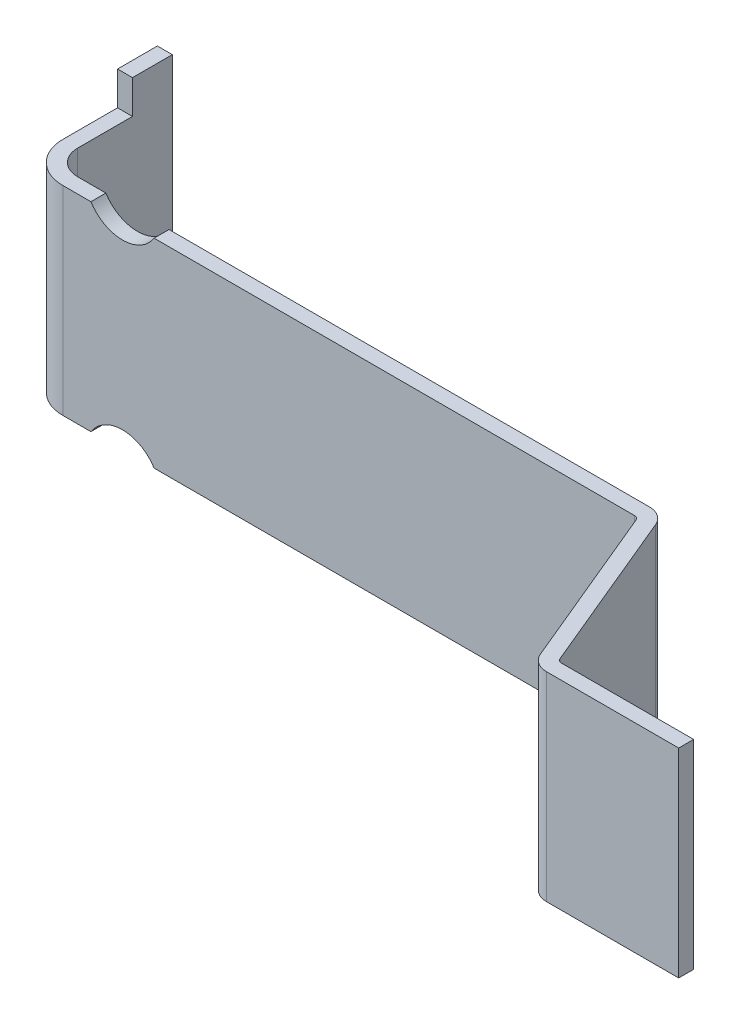
ISO-10303-21;
HEADER;
FILE_DESCRIPTION(('STEP AP214'),'2;1');
FILE_NAME('part.step','',(''),(''),'','','');
FILE_SCHEMA(('AUTOMOTIVE_DESIGN { 1 0 10303 214 1 1 1 1 }'));
ENDSEC;
DATA;
#1=APPLICATION_CONTEXT('core data for automotive mechanical design processes');
#2=APPLICATION_PROTOCOL_DEFINITION('international standard','automotive_design',2000,#1);
#3=PRODUCT_CONTEXT('',#1,'mechanical');
#4=PRODUCT('Part','Part','',(#3));
#5=PRODUCT_RELATED_PRODUCT_CATEGORY('part','',(#4));
#6=PRODUCT_DEFINITION_FORMATION('','',#4);
#7=PRODUCT_DEFINITION_CONTEXT('part definition',#1,'design');
#8=PRODUCT_DEFINITION('design','',#6,#7);
#9=PRODUCT_DEFINITION_SHAPE('','',#8);
#10=(LENGTH_UNIT() NAMED_UNIT(*) SI_UNIT(.MILLI.,.METRE.));
#11=(NAMED_UNIT(*) PLANE_ANGLE_UNIT() SI_UNIT($,.RADIAN.));
#12=(NAMED_UNIT(*) SI_UNIT($,.STERADIAN.) SOLID_ANGLE_UNIT());
#13=UNCERTAINTY_MEASURE_WITH_UNIT(LENGTH_MEASURE(1.E-05),#10,'distance_accuracy_value','');
#14=(GEOMETRIC_REPRESENTATION_CONTEXT(3) GLOBAL_UNCERTAINTY_ASSIGNED_CONTEXT((#13)) GLOBAL_UNIT_ASSIGNED_CONTEXT((#10,
#11,#12)) REPRESENTATION_CONTEXT('',''));
#15=CARTESIAN_POINT('',(0.,0.,0.));
#16=DIRECTION('',(0.,0.,1.));
#17=DIRECTION('',(1.,0.,0.));
#18=AXIS2_PLACEMENT_3D('',#15,#16,#17);
#19=CARTESIAN_POINT('',(0.15,0.,-0.4));
#20=DIRECTION('',(1.,0.,0.));
#21=DIRECTION('',(0.,0.,-1.));
#22=AXIS2_PLACEMENT_3D('',#19,#20,#21);
#23=PLANE('',#22);
#24=DIRECTION('',(0.,0.,1.));
#25=VECTOR('',#24,1.);
#26=CARTESIAN_POINT('',(0.15,2.675,0.));
#27=LINE('',#26,#25);
#28=CARTESIAN_POINT('',(0.15,2.675,0.4));
#29=VERTEX_POINT('',#28);
#30=CARTESIAN_POINT('',(0.15,2.675,-0.4));
#31=VERTEX_POINT('',#30);
#32=EDGE_CURVE('E302',#29,#31,#27,.F.);
#33=ORIENTED_EDGE('',*,*,#32,.F.);
#34=DIRECTION('',(0.,1.,0.));
#35=VECTOR('',#34,1.);
#36=CARTESIAN_POINT('',(0.15,0.,0.4));
#37=LINE('',#36,#35);
#38=CARTESIAN_POINT('',(0.15,2.,0.4));
#39=VERTEX_POINT('',#38);
#40=EDGE_CURVE('E306',#29,#39,#37,.F.);
#41=ORIENTED_EDGE('',*,*,#40,.T.);
#42=DIRECTION('',(0.,0.,-1.));
#43=VECTOR('',#42,1.);
#44=CARTESIAN_POINT('',(0.15,2.,-0.4));
#45=LINE('',#44,#43);
#46=CARTESIAN_POINT('',(0.15,2.,1.5));
#47=VERTEX_POINT('',#46);
#48=EDGE_CURVE('E314',#39,#47,#45,.F.);
#49=ORIENTED_EDGE('',*,*,#48,.T.);
#50=DIRECTION('',(0.,1.,0.));
#51=VECTOR('',#50,1.);
#52=CARTESIAN_POINT('',(0.150000000000001,0.,1.5));
#53=LINE('',#52,#51);
#54=CARTESIAN_POINT('',(0.15,-2.,1.5));
#55=VERTEX_POINT('',#54);
#56=EDGE_CURVE('E309',#47,#55,#53,.F.);
#57=ORIENTED_EDGE('',*,*,#56,.T.);
#58=DIRECTION('',(0.,0.,-1.));
#59=VECTOR('',#58,1.);
#60=CARTESIAN_POINT('',(0.15,-2.,-0.4));
#61=LINE('',#60,#59);
#62=CARTESIAN_POINT('',(0.15,-2.,0.4));
#63=VERTEX_POINT('',#62);
#64=EDGE_CURVE('E316',#55,#63,#61,.T.);
#65=ORIENTED_EDGE('',*,*,#64,.T.);
#66=DIRECTION('',(0.,1.,0.));
#67=VECTOR('',#66,1.);
#68=CARTESIAN_POINT('',(0.15,0.,0.4));
#69=LINE('',#68,#67);
#70=CARTESIAN_POINT('',(0.15,-2.675,0.4));
#71=VERTEX_POINT('',#70);
#72=EDGE_CURVE('E321',#63,#71,#69,.F.);
#73=ORIENTED_EDGE('',*,*,#72,.T.);
#74=DIRECTION('',(0.,0.,1.));
#75=VECTOR('',#74,1.);
#76=CARTESIAN_POINT('',(0.15,-2.675,0.));
#77=LINE('',#76,#75);
#78=CARTESIAN_POINT('',(0.15,-2.675,-0.4));
#79=VERTEX_POINT('',#78);
#80=EDGE_CURVE('E280',#71,#79,#77,.F.);
#81=ORIENTED_EDGE('',*,*,#80,.T.);
#82=DIRECTION('',(0.,1.,0.));
#83=VECTOR('',#82,1.);
#84=CARTESIAN_POINT('',(0.15,0.,-0.4));
#85=LINE('',#84,#83);
#86=EDGE_CURVE('E305',#31,#79,#85,.F.);
#87=ORIENTED_EDGE('',*,*,#86,.F.);
#88=EDGE_LOOP('',(#33,#41,#49,#57,#65,#73,#81,#87));
#89=FACE_BOUND('',#88,.T.);
#90=ADVANCED_FACE('F16',(#89),#23,.T.);
#91=CARTESIAN_POINT('',(0.,2.675,0.));
#92=DIRECTION('',(0.,1.,0.));
#93=DIRECTION('',(0.,0.,1.));
#94=AXIS2_PLACEMENT_3D('',#91,#92,#93);
#95=PLANE('',#94);
#96=DIRECTION('',(-1.,0.,0.));
#97=VECTOR('',#96,1.);
#98=CARTESIAN_POINT('',(-0.15,2.675,-0.4));
#99=LINE('',#98,#97);
#100=CARTESIAN_POINT('',(-0.15,2.675,-0.4));
#101=VERTEX_POINT('',#100);
#102=EDGE_CURVE('E283',#101,#31,#99,.F.);
#103=ORIENTED_EDGE('',*,*,#102,.F.);
#104=DIRECTION('',(0.,0.,1.));
#105=VECTOR('',#104,1.);
#106=CARTESIAN_POINT('',(-0.15,2.675,1.5));
#107=LINE('',#106,#105);
#108=CARTESIAN_POINT('',(-0.15,2.675,0.4));
#109=VERTEX_POINT('',#108);
#110=EDGE_CURVE('E253',#109,#101,#107,.F.);
#111=ORIENTED_EDGE('',*,*,#110,.F.);
#112=DIRECTION('',(1.,0.,0.));
#113=VECTOR('',#112,1.);
#114=CARTESIAN_POINT('',(-0.15,2.675,0.4));
#115=LINE('',#114,#113);
#116=EDGE_CURVE('E257',#29,#109,#115,.F.);
#117=ORIENTED_EDGE('',*,*,#116,.F.);
#118=ORIENTED_EDGE('',*,*,#32,.T.);
#119=EDGE_LOOP('',(#103,#111,#117,#118));
#120=FACE_BOUND('',#119,.T.);
#121=ADVANCED_FACE('F671',(#120),#95,.T.);
#122=CARTESIAN_POINT('',(-0.15,0.,-0.4));
#123=DIRECTION('',(0.,0.,-1.));
#124=DIRECTION('',(-1.,0.,0.));
#125=AXIS2_PLACEMENT_3D('',#122,#123,#124);
#126=PLANE('',#125);
#127=DIRECTION('',(0.,1.,0.));
#128=VECTOR('',#127,1.);
#129=CARTESIAN_POINT('',(-0.15,0.,-0.4));
#130=LINE('',#129,#128);
#131=CARTESIAN_POINT('',(-0.15,-2.675,-0.4));
#132=VERTEX_POINT('',#131);
#133=EDGE_CURVE('E250',#101,#132,#130,.F.);
#134=ORIENTED_EDGE('',*,*,#133,.F.);
#135=ORIENTED_EDGE('',*,*,#102,.T.);
#136=ORIENTED_EDGE('',*,*,#86,.T.);
#137=DIRECTION('',(1.,0.,0.));
#138=VECTOR('',#137,1.);
#139=CARTESIAN_POINT('',(0.,-2.675,-0.4));
#140=LINE('',#139,#138);
#141=EDGE_CURVE('E143',#79,#132,#140,.F.);
#142=ORIENTED_EDGE('',*,*,#141,.T.);
#143=EDGE_LOOP('',(#134,#135,#136,#142));
#144=FACE_BOUND('',#143,.T.);
#145=ADVANCED_FACE('F662',(#144),#126,.T.);
#146=CARTESIAN_POINT('',(0.,-2.675,0.));
#147=DIRECTION('',(0.,1.,0.));
#148=DIRECTION('',(0.,0.,1.));
#149=AXIS2_PLACEMENT_3D('',#146,#147,#148);
#150=PLANE('',#149);
#151=ORIENTED_EDGE('',*,*,#80,.F.);
#152=DIRECTION('',(1.,0.,0.));
#153=VECTOR('',#152,1.);
#154=CARTESIAN_POINT('',(-0.15,-2.675,0.4));
#155=LINE('',#154,#153);
#156=CARTESIAN_POINT('',(-0.15,-2.675,0.4));
#157=VERTEX_POINT('',#156);
#158=EDGE_CURVE('E150',#157,#71,#155,.T.);
#159=ORIENTED_EDGE('',*,*,#158,.F.);
#160=DIRECTION('',(0.,0.,1.));
#161=VECTOR('',#160,1.);
#162=CARTESIAN_POINT('',(-0.15,-2.675,1.5));
#163=LINE('',#162,#161);
#164=EDGE_CURVE('E247',#132,#157,#163,.T.);
#165=ORIENTED_EDGE('',*,*,#164,.F.);
#166=ORIENTED_EDGE('',*,*,#141,.F.);
#167=EDGE_LOOP('',(#151,#159,#165,#166));
#168=FACE_BOUND('',#167,.T.);
#169=ADVANCED_FACE('F654',(#168),#150,.F.);
#170=CARTESIAN_POINT('',(13.9666666666667,0.,5.5));
#171=DIRECTION('',(0.,1.,0.));
#172=DIRECTION('',(0.,0.,1.));
#173=AXIS2_PLACEMENT_3D('',#170,#171,#172);
#174=CYLINDRICAL_SURFACE('',#173,0.400000000000004);
#175=CARTESIAN_POINT('',(13.9666666666667,-2.,5.5));
#176=DIRECTION('',(0.,1.,0.));
#177=DIRECTION('',(0.,0.,1.));
#178=AXIS2_PLACEMENT_3D('',#175,#176,#177);
#179=CIRCLE('',#178,0.400000000000004);
#180=CARTESIAN_POINT('',(13.5974358974359,-2.,5.65384615384615));
#181=VERTEX_POINT('',#180);
#182=CARTESIAN_POINT('',(13.9666666666667,-2.,5.9));
#183=VERTEX_POINT('',#182);
#184=EDGE_CURVE('E142',#181,#183,#179,.T.);
#185=ORIENTED_EDGE('',*,*,#184,.T.);
#186=DIRECTION('',(0.,1.,0.));
#187=VECTOR('',#186,1.);
#188=CARTESIAN_POINT('',(13.9666666666667,0.,5.9));
#189=LINE('',#188,#187);
#190=CARTESIAN_POINT('',(13.9666666666667,2.,5.9));
#191=VERTEX_POINT('',#190);
#192=EDGE_CURVE('E140',#191,#183,#189,.F.);
#193=ORIENTED_EDGE('',*,*,#192,.F.);
#194=CARTESIAN_POINT('',(13.9666666666667,2.,5.5));
#195=DIRECTION('',(0.,1.,0.));
#196=DIRECTION('',(0.,0.,1.));
#197=AXIS2_PLACEMENT_3D('',#194,#195,#196);
#198=CIRCLE('',#197,0.400000000000004);
#199=CARTESIAN_POINT('',(13.5974358974359,2.,5.65384615384615));
#200=VERTEX_POINT('',#199);
#201=EDGE_CURVE('E19',#191,#200,#198,.F.);
#202=ORIENTED_EDGE('',*,*,#201,.T.);
#203=DIRECTION('',(0.,1.,0.));
#204=VECTOR('',#203,1.);
#205=CARTESIAN_POINT('',(13.5974358974359,0.,5.65384615384615));
#206=LINE('',#205,#204);
#207=EDGE_CURVE('E137',#181,#200,#206,.T.);
#208=ORIENTED_EDGE('',*,*,#207,.F.);
#209=EDGE_LOOP('',(#185,#193,#202,#208));
#210=FACE_BOUND('',#209,.T.);
#211=ADVANCED_FACE('F136',(#210),#174,.T.);
#212=CARTESIAN_POINT('',(16.62,0.,5.6));
#213=DIRECTION('',(1.,0.,0.));
#214=DIRECTION('',(0.,0.,-1.));
#215=AXIS2_PLACEMENT_3D('',#212,#213,#214);
#216=PLANE('',#215);
#217=DIRECTION('',(0.,0.,-1.));
#218=VECTOR('',#217,1.);
#219=CARTESIAN_POINT('',(16.62,-2.,5.6));
#220=LINE('',#219,#218);
#221=CARTESIAN_POINT('',(16.62,-2.,5.9));
#222=VERTEX_POINT('',#221);
#223=CARTESIAN_POINT('',(16.62,-2.,5.6));
#224=VERTEX_POINT('',#223);
#225=EDGE_CURVE('E270',#222,#224,#220,.T.);
#226=ORIENTED_EDGE('',*,*,#225,.T.);
#227=DIRECTION('',(0.,1.,0.));
#228=VECTOR('',#227,1.);
#229=CARTESIAN_POINT('',(16.62,0.,5.6));
#230=LINE('',#229,#228);
#231=CARTESIAN_POINT('',(16.62,2.,5.6));
#232=VERTEX_POINT('',#231);
#233=EDGE_CURVE('E228',#232,#224,#230,.F.);
#234=ORIENTED_EDGE('',*,*,#233,.F.);
#235=DIRECTION('',(0.,0.,-1.));
#236=VECTOR('',#235,1.);
#237=CARTESIAN_POINT('',(16.62,2.,5.6));
#238=LINE('',#237,#236);
#239=CARTESIAN_POINT('',(16.62,2.,5.9));
#240=VERTEX_POINT('',#239);
#241=EDGE_CURVE('E268',#232,#240,#238,.F.);
#242=ORIENTED_EDGE('',*,*,#241,.T.);
#243=DIRECTION('',(0.,1.,0.));
#244=VECTOR('',#243,1.);
#245=CARTESIAN_POINT('',(16.62,0.,5.9));
#246=LINE('',#245,#244);
#247=EDGE_CURVE('E231',#222,#240,#246,.T.);
#248=ORIENTED_EDGE('',*,*,#247,.F.);
#249=EDGE_LOOP('',(#226,#234,#242,#248));
#250=FACE_BOUND('',#249,.T.);
#251=ADVANCED_FACE('F373',(#250),#216,.T.);
#252=CARTESIAN_POINT('',(13.9666666666667,0.,5.5));
#253=DIRECTION('',(0.,1.,0.));
#254=DIRECTION('',(0.,0.,1.));
#255=AXIS2_PLACEMENT_3D('',#252,#253,#254);
#256=CYLINDRICAL_SURFACE('',#255,0.099999999999999);
#257=DIRECTION('',(0.,1.,0.));
#258=VECTOR('',#257,1.);
#259=CARTESIAN_POINT('',(13.9666666666667,0.,5.6));
#260=LINE('',#259,#258);
#261=CARTESIAN_POINT('',(13.9666666666667,-2.,5.6));
#262=VERTEX_POINT('',#261);
#263=CARTESIAN_POINT('',(13.9666666666667,2.,5.6));
#264=VERTEX_POINT('',#263);
#265=EDGE_CURVE('E223',#262,#264,#260,.T.);
#266=ORIENTED_EDGE('',*,*,#265,.F.);
#267=CARTESIAN_POINT('',(13.9666666666667,-2.,5.5));
#268=DIRECTION('',(0.,1.,0.));
#269=DIRECTION('',(0.,0.,1.));
#270=AXIS2_PLACEMENT_3D('',#267,#268,#269);
#271=CIRCLE('',#270,0.099999999999999);
#272=CARTESIAN_POINT('',(13.874358974359,-2.,5.53846153846154));
#273=VERTEX_POINT('',#272);
#274=EDGE_CURVE('E275',#273,#262,#271,.T.);
#275=ORIENTED_EDGE('',*,*,#274,.F.);
#276=DIRECTION('',(0.,1.,0.));
#277=VECTOR('',#276,1.);
#278=CARTESIAN_POINT('',(13.874358974359,0.,5.53846153846154));
#279=LINE('',#278,#277);
#280=CARTESIAN_POINT('',(13.874358974359,2.,5.53846153846154));
#281=VERTEX_POINT('',#280);
#282=EDGE_CURVE('E220',#281,#273,#279,.F.);
#283=ORIENTED_EDGE('',*,*,#282,.F.);
#284=CARTESIAN_POINT('',(13.9666666666667,2.,5.5));
#285=DIRECTION('',(0.,1.,0.));
#286=DIRECTION('',(0.,0.,1.));
#287=AXIS2_PLACEMENT_3D('',#284,#285,#286);
#288=CIRCLE('',#287,0.099999999999999);
#289=EDGE_CURVE('E359',#264,#281,#288,.F.);
#290=ORIENTED_EDGE('',*,*,#289,.F.);
#291=EDGE_LOOP('',(#266,#275,#283,#290));
#292=FACE_BOUND('',#291,.T.);
#293=ADVANCED_FACE('F630',(#292),#256,.F.);
#294=CARTESIAN_POINT('',(12.1333333333333,0.,2.4));
#295=DIRECTION('',(0.,1.,0.));
#296=DIRECTION('',(0.,0.,1.));
#297=AXIS2_PLACEMENT_3D('',#294,#295,#296);
#298=CYLINDRICAL_SURFACE('',#297,0.400000000000001);
#299=CARTESIAN_POINT('',(12.1333333333333,-2.,2.4));
#300=DIRECTION('',(0.,1.,0.));
#301=DIRECTION('',(0.,0.,1.));
#302=AXIS2_PLACEMENT_3D('',#299,#300,#301);
#303=CIRCLE('',#302,0.400000000000001);
#304=CARTESIAN_POINT('',(12.5025641025641,-2.,2.24615384615385));
#305=VERTEX_POINT('',#304);
#306=CARTESIAN_POINT('',(12.1333333333333,-2.,2.));
#307=VERTEX_POINT('',#306);
#308=EDGE_CURVE('E313',#305,#307,#303,.T.);
#309=ORIENTED_EDGE('',*,*,#308,.T.);
#310=DIRECTION('',(0.,1.,0.));
#311=VECTOR('',#310,1.);
#312=CARTESIAN_POINT('',(12.1333333333333,0.,2.));
#313=LINE('',#312,#311);
#314=CARTESIAN_POINT('',(12.1333333333333,2.,2.));
#315=VERTEX_POINT('',#314);
#316=EDGE_CURVE('E215',#315,#307,#313,.F.);
#317=ORIENTED_EDGE('',*,*,#316,.F.);
#318=CARTESIAN_POINT('',(12.1333333333333,2.,2.4));
#319=DIRECTION('',(0.,1.,0.));
#320=DIRECTION('',(0.,0.,1.));
#321=AXIS2_PLACEMENT_3D('',#318,#319,#320);
#322=CIRCLE('',#321,0.400000000000001);
#323=CARTESIAN_POINT('',(12.5025641025641,2.,2.24615384615385));
#324=VERTEX_POINT('',#323);
#325=EDGE_CURVE('E357',#315,#324,#322,.F.);
#326=ORIENTED_EDGE('',*,*,#325,.T.);
#327=DIRECTION('',(0.,1.,0.));
#328=VECTOR('',#327,1.);
#329=CARTESIAN_POINT('',(12.5025641025641,0.,2.24615384615385));
#330=LINE('',#329,#328);
#331=EDGE_CURVE('E219',#305,#324,#330,.T.);
#332=ORIENTED_EDGE('',*,*,#331,.F.);
#333=EDGE_LOOP('',(#309,#317,#326,#332));
#334=FACE_BOUND('',#333,.T.);
#335=ADVANCED_FACE('F622',(#334),#298,.T.);
#336=CARTESIAN_POINT('',(0.65,0.,1.5));
#337=DIRECTION('',(0.,1.,0.));
#338=DIRECTION('',(0.,0.,1.));
#339=AXIS2_PLACEMENT_3D('',#336,#337,#338);
#340=CYLINDRICAL_SURFACE('',#339,0.499999999999999);
#341=DIRECTION('',(0.,1.,0.));
#342=VECTOR('',#341,1.);
#343=CARTESIAN_POINT('',(0.65,0.,2.));
#344=LINE('',#343,#342);
#345=CARTESIAN_POINT('',(0.65,-2.,2.));
#346=VERTEX_POINT('',#345);
#347=CARTESIAN_POINT('',(0.65,2.,2.));
#348=VERTEX_POINT('',#347);
#349=EDGE_CURVE('E218',#346,#348,#344,.T.);
#350=ORIENTED_EDGE('',*,*,#349,.F.);
#351=CARTESIAN_POINT('',(0.65,-2.,1.5));
#352=DIRECTION('',(0.,1.,0.));
#353=DIRECTION('',(0.,0.,1.));
#354=AXIS2_PLACEMENT_3D('',#351,#352,#353);
#355=CIRCLE('',#354,0.499999999999999);
#356=EDGE_CURVE('E312',#55,#346,#355,.T.);
#357=ORIENTED_EDGE('',*,*,#356,.F.);
#358=ORIENTED_EDGE('',*,*,#56,.F.);
#359=CARTESIAN_POINT('',(0.65,2.,1.5));
#360=DIRECTION('',(0.,1.,0.));
#361=DIRECTION('',(0.,0.,1.));
#362=AXIS2_PLACEMENT_3D('',#359,#360,#361);
#363=CIRCLE('',#362,0.499999999999999);
#364=EDGE_CURVE('E286',#348,#47,#363,.F.);
#365=ORIENTED_EDGE('',*,*,#364,.F.);
#366=EDGE_LOOP('',(#350,#357,#358,#365));
#367=FACE_BOUND('',#366,.T.);
#368=ADVANCED_FACE('F427',(#367),#340,.F.);
#369=CARTESIAN_POINT('',(-0.15,0.,0.4));
#370=DIRECTION('',(0.,0.,1.));
#371=DIRECTION('',(1.,0.,0.));
#372=AXIS2_PLACEMENT_3D('',#369,#370,#371);
#373=PLANE('',#372);
#374=ORIENTED_EDGE('',*,*,#116,.T.);
#375=DIRECTION('',(0.,1.,0.));
#376=VECTOR('',#375,1.);
#377=CARTESIAN_POINT('',(-0.15,0.,0.4));
#378=LINE('',#377,#376);
#379=CARTESIAN_POINT('',(-0.150000000000001,2.,0.4));
#380=VERTEX_POINT('',#379);
#381=EDGE_CURVE('E256',#380,#109,#378,.T.);
#382=ORIENTED_EDGE('',*,*,#381,.F.);
#383=DIRECTION('',(1.,0.,0.));
#384=VECTOR('',#383,1.);
#385=CARTESIAN_POINT('',(7.94499582800047,2.,0.4));
#386=LINE('',#385,#384);
#387=EDGE_CURVE('E205',#39,#380,#386,.F.);
#388=ORIENTED_EDGE('',*,*,#387,.F.);
#389=ORIENTED_EDGE('',*,*,#40,.F.);
#390=EDGE_LOOP('',(#374,#382,#388,#389));
#391=FACE_BOUND('',#390,.T.);
#392=ADVANCED_FACE('F435',(#391),#373,.T.);
#393=CARTESIAN_POINT('',(-0.15,0.,1.5));
#394=DIRECTION('',(-1.,0.,0.));
#395=DIRECTION('',(0.,0.,1.));
#396=AXIS2_PLACEMENT_3D('',#393,#394,#395);
#397=PLANE('',#396);
#398=ORIENTED_EDGE('',*,*,#164,.T.);
#399=DIRECTION('',(0.,1.,0.));
#400=VECTOR('',#399,1.);
#401=CARTESIAN_POINT('',(-0.15,0.,0.4));
#402=LINE('',#401,#400);
#403=CARTESIAN_POINT('',(-0.15,-2.,0.4));
#404=VERTEX_POINT('',#403);
#405=EDGE_CURVE('E244',#404,#157,#402,.F.);
#406=ORIENTED_EDGE('',*,*,#405,.F.);
#407=DIRECTION('',(0.,0.,1.));
#408=VECTOR('',#407,1.);
#409=CARTESIAN_POINT('',(-0.15,-2.,1.5));
#410=LINE('',#409,#408);
#411=CARTESIAN_POINT('',(-0.15,-2.,1.5));
#412=VERTEX_POINT('',#411);
#413=EDGE_CURVE('E254',#404,#412,#410,.T.);
#414=ORIENTED_EDGE('',*,*,#413,.T.);
#415=DIRECTION('',(0.,1.,0.));
#416=VECTOR('',#415,1.);
#417=CARTESIAN_POINT('',(-0.15,0.,1.5));
#418=LINE('',#417,#416);
#419=CARTESIAN_POINT('',(-0.15,2.,1.5));
#420=VERTEX_POINT('',#419);
#421=EDGE_CURVE('E196',#420,#412,#418,.F.);
#422=ORIENTED_EDGE('',*,*,#421,.F.);
#423=DIRECTION('',(0.,0.,1.));
#424=VECTOR('',#423,1.);
#425=CARTESIAN_POINT('',(-0.150000000000001,2.,2.79705748867239));
#426=LINE('',#425,#424);
#427=EDGE_CURVE('E202',#380,#420,#426,.T.);
#428=ORIENTED_EDGE('',*,*,#427,.F.);
#429=ORIENTED_EDGE('',*,*,#381,.T.);
#430=ORIENTED_EDGE('',*,*,#110,.T.);
#431=ORIENTED_EDGE('',*,*,#133,.T.);
#432=EDGE_LOOP('',(#398,#406,#414,#422,#428,#429,#430,#431));
#433=FACE_BOUND('',#432,.T.);
#434=ADVANCED_FACE('F463',(#433),#397,.T.);
#435=CARTESIAN_POINT('',(-0.15,0.,0.4));
#436=DIRECTION('',(0.,0.,1.));
#437=DIRECTION('',(1.,0.,0.));
#438=AXIS2_PLACEMENT_3D('',#435,#436,#437);
#439=PLANE('',#438);
#440=ORIENTED_EDGE('',*,*,#158,.T.);
#441=ORIENTED_EDGE('',*,*,#72,.F.);
#442=DIRECTION('',(1.,0.,0.));
#443=VECTOR('',#442,1.);
#444=CARTESIAN_POINT('',(7.94499582800047,-2.,0.4));
#445=LINE('',#444,#443);
#446=EDGE_CURVE('E195',#63,#404,#445,.F.);
#447=ORIENTED_EDGE('',*,*,#446,.T.);
#448=ORIENTED_EDGE('',*,*,#405,.T.);
#449=EDGE_LOOP('',(#440,#441,#447,#448));
#450=FACE_BOUND('',#449,.T.);
#451=ADVANCED_FACE('F467',(#450),#439,.T.);
#452=CARTESIAN_POINT('',(13.5974358974359,0.,5.65384615384615));
#453=DIRECTION('',(-0.923076923076923,0.,0.384615384615385));
#454=DIRECTION('',(0.384615384615385,0.,0.923076923076923));
#455=AXIS2_PLACEMENT_3D('',#452,#453,#454);
#456=PLANE('',#455);
#457=DIRECTION('',(0.384615384615385,0.,0.923076923076923));
#458=VECTOR('',#457,1.);
#459=CARTESIAN_POINT('',(12.225641025641,-2.,2.36153846153846));
#460=LINE('',#459,#458);
#461=CARTESIAN_POINT('',(12.225641025641,-2.,2.36153846153846));
#462=VERTEX_POINT('',#461);
#463=EDGE_CURVE('E149',#462,#181,#460,.T.);
#464=ORIENTED_EDGE('',*,*,#463,.T.);
#465=ORIENTED_EDGE('',*,*,#207,.T.);
#466=DIRECTION('',(0.384615384615385,0.,0.923076923076923));
#467=VECTOR('',#466,1.);
#468=CARTESIAN_POINT('',(12.225641025641,2.,2.36153846153846));
#469=LINE('',#468,#467);
#470=CARTESIAN_POINT('',(12.225641025641,2.,2.36153846153846));
#471=VERTEX_POINT('',#470);
#472=EDGE_CURVE('E147',#471,#200,#469,.T.);
#473=ORIENTED_EDGE('',*,*,#472,.F.);
#474=DIRECTION('',(0.,1.,0.));
#475=VECTOR('',#474,1.);
#476=CARTESIAN_POINT('',(12.225641025641,0.,2.36153846153846));
#477=LINE('',#476,#475);
#478=EDGE_CURVE('E188',#471,#462,#477,.F.);
#479=ORIENTED_EDGE('',*,*,#478,.T.);
#480=EDGE_LOOP('',(#464,#465,#473,#479));
#481=FACE_BOUND('',#480,.T.);
#482=ADVANCED_FACE('F146',(#481),#456,.T.);
#483=CARTESIAN_POINT('',(16.62,0.,5.9));
#484=DIRECTION('',(0.,0.,1.));
#485=DIRECTION('',(1.,0.,0.));
#486=AXIS2_PLACEMENT_3D('',#483,#484,#485);
#487=PLANE('',#486);
#488=DIRECTION('',(1.,0.,0.));
#489=VECTOR('',#488,1.);
#490=CARTESIAN_POINT('',(7.94499582800047,-2.,5.9));
#491=LINE('',#490,#489);
#492=EDGE_CURVE('E177',#183,#222,#491,.T.);
#493=ORIENTED_EDGE('',*,*,#492,.T.);
#494=ORIENTED_EDGE('',*,*,#247,.T.);
#495=DIRECTION('',(1.,0.,0.));
#496=VECTOR('',#495,1.);
#497=CARTESIAN_POINT('',(7.94499582800047,2.,5.9));
#498=LINE('',#497,#496);
#499=EDGE_CURVE('E153',#191,#240,#498,.T.);
#500=ORIENTED_EDGE('',*,*,#499,.F.);
#501=ORIENTED_EDGE('',*,*,#192,.T.);
#502=EDGE_LOOP('',(#493,#494,#500,#501));
#503=FACE_BOUND('',#502,.T.);
#504=ADVANCED_FACE('F364',(#503),#487,.T.);
#505=CARTESIAN_POINT('',(13.9666666666667,0.,5.6));
#506=DIRECTION('',(0.,0.,-1.));
#507=DIRECTION('',(-1.,0.,0.));
#508=AXIS2_PLACEMENT_3D('',#505,#506,#507);
#509=PLANE('',#508);
#510=DIRECTION('',(1.,0.,0.));
#511=VECTOR('',#510,1.);
#512=CARTESIAN_POINT('',(7.94499582800047,-2.,5.6));
#513=LINE('',#512,#511);
#514=EDGE_CURVE('E174',#224,#262,#513,.F.);
#515=ORIENTED_EDGE('',*,*,#514,.T.);
#516=ORIENTED_EDGE('',*,*,#265,.T.);
#517=DIRECTION('',(1.,0.,0.));
#518=VECTOR('',#517,1.);
#519=CARTESIAN_POINT('',(7.94499582800047,2.,5.6));
#520=LINE('',#519,#518);
#521=EDGE_CURVE('E155',#232,#264,#520,.F.);
#522=ORIENTED_EDGE('',*,*,#521,.F.);
#523=ORIENTED_EDGE('',*,*,#233,.T.);
#524=EDGE_LOOP('',(#515,#516,#522,#523));
#525=FACE_BOUND('',#524,.T.);
#526=ADVANCED_FACE('F379',(#525),#509,.T.);
#527=CARTESIAN_POINT('',(12.5025641025641,0.,2.24615384615385));
#528=DIRECTION('',(0.923076923076923,0.,-0.384615384615384));
#529=DIRECTION('',(-0.384615384615384,0.,-0.923076923076923));
#530=AXIS2_PLACEMENT_3D('',#527,#528,#529);
#531=PLANE('',#530);
#532=DIRECTION('',(-0.384615384615385,0.,-0.923076923076923));
#533=VECTOR('',#532,1.);
#534=CARTESIAN_POINT('',(13.874358974359,-2.,5.53846153846154));
#535=LINE('',#534,#533);
#536=EDGE_CURVE('E171',#273,#305,#535,.T.);
#537=ORIENTED_EDGE('',*,*,#536,.T.);
#538=ORIENTED_EDGE('',*,*,#331,.T.);
#539=DIRECTION('',(-0.384615384615385,0.,-0.923076923076923));
#540=VECTOR('',#539,1.);
#541=CARTESIAN_POINT('',(13.874358974359,2.,5.53846153846154));
#542=LINE('',#541,#540);
#543=EDGE_CURVE('E381',#281,#324,#542,.T.);
#544=ORIENTED_EDGE('',*,*,#543,.F.);
#545=ORIENTED_EDGE('',*,*,#282,.T.);
#546=EDGE_LOOP('',(#537,#538,#544,#545));
#547=FACE_BOUND('',#546,.T.);
#548=ADVANCED_FACE('F504',(#547),#531,.T.);
#549=CARTESIAN_POINT('',(0.65,0.,2.));
#550=DIRECTION('',(0.,0.,-1.));
#551=DIRECTION('',(-1.,0.,0.));
#552=AXIS2_PLACEMENT_3D('',#549,#550,#551);
#553=PLANE('',#552);
#554=ORIENTED_EDGE('',*,*,#349,.T.);
#555=DIRECTION('',(1.,0.,0.));
#556=VECTOR('',#555,1.);
#557=CARTESIAN_POINT('',(7.94499582800047,2.,2.));
#558=LINE('',#557,#556);
#559=CARTESIAN_POINT('',(1.21557112297752,2.,2.));
#560=VERTEX_POINT('',#559);
#561=EDGE_CURVE('E208',#560,#348,#558,.F.);
#562=ORIENTED_EDGE('',*,*,#561,.F.);
#563=CARTESIAN_POINT('',(1.85,2.4,2.));
#564=DIRECTION('',(0.,0.,-1.));
#565=DIRECTION('',(-1.,0.,0.));
#566=AXIS2_PLACEMENT_3D('',#563,#564,#565);
#567=CIRCLE('',#566,0.75);
#568=CARTESIAN_POINT('',(2.48442887702248,2.,2.));
#569=VERTEX_POINT('',#568);
#570=EDGE_CURVE('E214',#560,#569,#567,.F.);
#571=ORIENTED_EDGE('',*,*,#570,.T.);
#572=DIRECTION('',(1.,0.,0.));
#573=VECTOR('',#572,1.);
#574=CARTESIAN_POINT('',(7.94499582800047,2.,2.));
#575=LINE('',#574,#573);
#576=EDGE_CURVE('E345',#315,#569,#575,.F.);
#577=ORIENTED_EDGE('',*,*,#576,.F.);
#578=ORIENTED_EDGE('',*,*,#316,.T.);
#579=DIRECTION('',(1.,0.,0.));
#580=VECTOR('',#579,1.);
#581=CARTESIAN_POINT('',(7.94499582800047,-2.,2.));
#582=LINE('',#581,#580);
#583=CARTESIAN_POINT('',(2.48442887702248,-2.,2.));
#584=VERTEX_POINT('',#583);
#585=EDGE_CURVE('E168',#307,#584,#582,.F.);
#586=ORIENTED_EDGE('',*,*,#585,.T.);
#587=CARTESIAN_POINT('',(1.85,-2.4,2.));
#588=DIRECTION('',(0.,0.,-1.));
#589=DIRECTION('',(-1.,0.,0.));
#590=AXIS2_PLACEMENT_3D('',#587,#588,#589);
#591=CIRCLE('',#590,0.75);
#592=CARTESIAN_POINT('',(1.21557112297752,-2.,2.));
#593=VERTEX_POINT('',#592);
#594=EDGE_CURVE('E191',#584,#593,#591,.F.);
#595=ORIENTED_EDGE('',*,*,#594,.T.);
#596=DIRECTION('',(1.,0.,0.));
#597=VECTOR('',#596,1.);
#598=CARTESIAN_POINT('',(7.94499582800047,-2.,2.));
#599=LINE('',#598,#597);
#600=EDGE_CURVE('E192',#593,#346,#599,.F.);
#601=ORIENTED_EDGE('',*,*,#600,.T.);
#602=EDGE_LOOP('',(#554,#562,#571,#577,#578,#586,#595,#601));
#603=FACE_BOUND('',#602,.T.);
#604=ADVANCED_FACE('F419',(#603),#553,.T.);
#605=CARTESIAN_POINT('',(1.85,2.4,2.3));
#606=DIRECTION('',(0.,0.,-1.));
#607=DIRECTION('',(-1.,0.,0.));
#608=AXIS2_PLACEMENT_3D('',#605,#606,#607);
#609=CYLINDRICAL_SURFACE('',#608,0.75);
#610=CARTESIAN_POINT('',(1.85,2.4,2.3));
#611=DIRECTION('',(0.,0.,-1.));
#612=DIRECTION('',(-1.,0.,0.));
#613=AXIS2_PLACEMENT_3D('',#610,#611,#612);
#614=CIRCLE('',#613,0.75);
#615=CARTESIAN_POINT('',(2.48442887702248,2.,2.3));
#616=VERTEX_POINT('',#615);
#617=CARTESIAN_POINT('',(1.21557112297752,2.,2.3));
#618=VERTEX_POINT('',#617);
#619=EDGE_CURVE('E343',#616,#618,#614,.T.);
#620=ORIENTED_EDGE('',*,*,#619,.F.);
#621=DIRECTION('',(0.,0.,1.));
#622=VECTOR('',#621,1.);
#623=CARTESIAN_POINT('',(2.48442887702248,2.,2.79705748867239));
#624=LINE('',#623,#622);
#625=EDGE_CURVE('E157',#569,#616,#624,.T.);
#626=ORIENTED_EDGE('',*,*,#625,.F.);
#627=ORIENTED_EDGE('',*,*,#570,.F.);
#628=DIRECTION('',(0.,0.,1.));
#629=VECTOR('',#628,1.);
#630=CARTESIAN_POINT('',(1.21557112297752,2.,2.79705748867239));
#631=LINE('',#630,#629);
#632=EDGE_CURVE('E211',#618,#560,#631,.F.);
#633=ORIENTED_EDGE('',*,*,#632,.F.);
#634=EDGE_LOOP('',(#620,#626,#627,#633));
#635=FACE_BOUND('',#634,.T.);
#636=ADVANCED_FACE('F411',(#635),#609,.F.);
#637=CARTESIAN_POINT('',(7.94499582800047,2.,2.79705748867239));
#638=DIRECTION('',(0.,1.,0.));
#639=DIRECTION('',(0.,0.,1.));
#640=AXIS2_PLACEMENT_3D('',#637,#638,#639);
#641=PLANE('',#640);
#642=CARTESIAN_POINT('',(0.65,2.,1.5));
#643=DIRECTION('',(0.,1.,0.));
#644=DIRECTION('',(0.,0.,1.));
#645=AXIS2_PLACEMENT_3D('',#642,#643,#644);
#646=CIRCLE('',#645,0.8);
#647=CARTESIAN_POINT('',(0.65,2.,2.3));
#648=VERTEX_POINT('',#647);
#649=EDGE_CURVE('E204',#648,#420,#646,.F.);
#650=ORIENTED_EDGE('',*,*,#649,.F.);
#651=DIRECTION('',(1.,0.,0.));
#652=VECTOR('',#651,1.);
#653=CARTESIAN_POINT('',(12.1333333333333,2.,2.3));
#654=LINE('',#653,#652);
#655=EDGE_CURVE('E201',#618,#648,#654,.F.);
#656=ORIENTED_EDGE('',*,*,#655,.F.);
#657=ORIENTED_EDGE('',*,*,#632,.T.);
#658=ORIENTED_EDGE('',*,*,#561,.T.);
#659=ORIENTED_EDGE('',*,*,#364,.T.);
#660=ORIENTED_EDGE('',*,*,#48,.F.);
#661=ORIENTED_EDGE('',*,*,#387,.T.);
#662=ORIENTED_EDGE('',*,*,#427,.T.);
#663=EDGE_LOOP('',(#650,#656,#657,#658,#659,#660,#661,#662));
#664=FACE_BOUND('',#663,.T.);
#665=ADVANCED_FACE('F414',(#664),#641,.T.);
#666=CARTESIAN_POINT('',(0.65,0.,1.5));
#667=DIRECTION('',(0.,1.,0.));
#668=DIRECTION('',(0.,0.,1.));
#669=AXIS2_PLACEMENT_3D('',#666,#667,#668);
#670=CYLINDRICAL_SURFACE('',#669,0.8);
#671=CARTESIAN_POINT('',(0.65,-2.,1.5));
#672=DIRECTION('',(0.,1.,0.));
#673=DIRECTION('',(0.,0.,1.));
#674=AXIS2_PLACEMENT_3D('',#671,#672,#673);
#675=CIRCLE('',#674,0.8);
#676=CARTESIAN_POINT('',(0.65,-2.,2.3));
#677=VERTEX_POINT('',#676);
#678=EDGE_CURVE('E299',#412,#677,#675,.T.);
#679=ORIENTED_EDGE('',*,*,#678,.T.);
#680=DIRECTION('',(0.,1.,0.));
#681=VECTOR('',#680,1.);
#682=CARTESIAN_POINT('',(0.65,0.,2.3));
#683=LINE('',#682,#681);
#684=EDGE_CURVE('E197',#648,#677,#683,.F.);
#685=ORIENTED_EDGE('',*,*,#684,.F.);
#686=ORIENTED_EDGE('',*,*,#649,.T.);
#687=ORIENTED_EDGE('',*,*,#421,.T.);
#688=EDGE_LOOP('',(#679,#685,#686,#687));
#689=FACE_BOUND('',#688,.T.);
#690=ADVANCED_FACE('F494',(#689),#670,.T.);
#691=CARTESIAN_POINT('',(7.94499582800047,-2.,2.79705748867239));
#692=DIRECTION('',(0.,1.,0.));
#693=DIRECTION('',(0.,0.,1.));
#694=AXIS2_PLACEMENT_3D('',#691,#692,#693);
#695=PLANE('',#694);
#696=DIRECTION('',(1.,0.,0.));
#697=VECTOR('',#696,1.);
#698=CARTESIAN_POINT('',(12.1333333333333,-2.,2.3));
#699=LINE('',#698,#697);
#700=CARTESIAN_POINT('',(1.21557112297752,-2.,2.3));
#701=VERTEX_POINT('',#700);
#702=EDGE_CURVE('E200',#677,#701,#699,.T.);
#703=ORIENTED_EDGE('',*,*,#702,.F.);
#704=ORIENTED_EDGE('',*,*,#678,.F.);
#705=ORIENTED_EDGE('',*,*,#413,.F.);
#706=ORIENTED_EDGE('',*,*,#446,.F.);
#707=ORIENTED_EDGE('',*,*,#64,.F.);
#708=ORIENTED_EDGE('',*,*,#356,.T.);
#709=ORIENTED_EDGE('',*,*,#600,.F.);
#710=DIRECTION('',(0.,0.,-1.));
#711=VECTOR('',#710,1.);
#712=CARTESIAN_POINT('',(1.21557112297752,-2.,2.3));
#713=LINE('',#712,#711);
#714=EDGE_CURVE('E185',#593,#701,#713,.F.);
#715=ORIENTED_EDGE('',*,*,#714,.T.);
#716=EDGE_LOOP('',(#703,#704,#705,#706,#707,#708,#709,#715));
#717=FACE_BOUND('',#716,.T.);
#718=ADVANCED_FACE('F460',(#717),#695,.F.);
#719=CARTESIAN_POINT('',(1.85,-2.4,2.3));
#720=DIRECTION('',(0.,0.,-1.));
#721=DIRECTION('',(-1.,0.,0.));
#722=AXIS2_PLACEMENT_3D('',#719,#720,#721);
#723=CYLINDRICAL_SURFACE('',#722,0.75);
#724=CARTESIAN_POINT('',(1.85,-2.4,2.3));
#725=DIRECTION('',(0.,0.,-1.));
#726=DIRECTION('',(-1.,0.,0.));
#727=AXIS2_PLACEMENT_3D('',#724,#725,#726);
#728=CIRCLE('',#727,0.75);
#729=CARTESIAN_POINT('',(2.48442887702248,-2.,2.3));
#730=VERTEX_POINT('',#729);
#731=EDGE_CURVE('E340',#701,#730,#728,.T.);
#732=ORIENTED_EDGE('',*,*,#731,.F.);
#733=ORIENTED_EDGE('',*,*,#714,.F.);
#734=ORIENTED_EDGE('',*,*,#594,.F.);
#735=DIRECTION('',(0.,0.,1.));
#736=VECTOR('',#735,1.);
#737=CARTESIAN_POINT('',(2.48442887702248,-2.,2.79705748867239));
#738=LINE('',#737,#736);
#739=EDGE_CURVE('E170',#584,#730,#738,.T.);
#740=ORIENTED_EDGE('',*,*,#739,.T.);
#741=EDGE_LOOP('',(#732,#733,#734,#740));
#742=FACE_BOUND('',#741,.T.);
#743=ADVANCED_FACE('F489',(#742),#723,.F.);
#744=CARTESIAN_POINT('',(7.94499582800047,-2.,2.79705748867239));
#745=DIRECTION('',(0.,1.,0.));
#746=DIRECTION('',(0.,0.,1.));
#747=AXIS2_PLACEMENT_3D('',#744,#745,#746);
#748=PLANE('',#747);
#749=ORIENTED_EDGE('',*,*,#585,.F.);
#750=ORIENTED_EDGE('',*,*,#308,.F.);
#751=ORIENTED_EDGE('',*,*,#536,.F.);
#752=ORIENTED_EDGE('',*,*,#274,.T.);
#753=ORIENTED_EDGE('',*,*,#514,.F.);
#754=ORIENTED_EDGE('',*,*,#225,.F.);
#755=ORIENTED_EDGE('',*,*,#492,.F.);
#756=ORIENTED_EDGE('',*,*,#184,.F.);
#757=ORIENTED_EDGE('',*,*,#463,.F.);
#758=CARTESIAN_POINT('',(12.1333333333333,-2.,2.4));
#759=DIRECTION('',(0.,1.,0.));
#760=DIRECTION('',(0.,0.,1.));
#761=AXIS2_PLACEMENT_3D('',#758,#759,#760);
#762=CIRCLE('',#761,0.099999999999997);
#763=CARTESIAN_POINT('',(12.1333333333333,-2.,2.3));
#764=VERTEX_POINT('',#763);
#765=EDGE_CURVE('E167',#462,#764,#762,.T.);
#766=ORIENTED_EDGE('',*,*,#765,.T.);
#767=DIRECTION('',(1.,0.,0.));
#768=VECTOR('',#767,1.);
#769=CARTESIAN_POINT('',(12.1333333333333,-2.,2.3));
#770=LINE('',#769,#768);
#771=EDGE_CURVE('E164',#730,#764,#770,.T.);
#772=ORIENTED_EDGE('',*,*,#771,.F.);
#773=ORIENTED_EDGE('',*,*,#739,.F.);
#774=EDGE_LOOP('',(#749,#750,#751,#752,#753,#754,#755,#756,#757,#766,#772,#773));
#775=FACE_BOUND('',#774,.T.);
#776=ADVANCED_FACE('F367',(#775),#748,.F.);
#777=CARTESIAN_POINT('',(12.1333333333333,0.,2.4));
#778=DIRECTION('',(0.,1.,0.));
#779=DIRECTION('',(0.,0.,1.));
#780=AXIS2_PLACEMENT_3D('',#777,#778,#779);
#781=CYLINDRICAL_SURFACE('',#780,0.099999999999997);
#782=DIRECTION('',(0.,1.,0.));
#783=VECTOR('',#782,1.);
#784=CARTESIAN_POINT('',(12.1333333333333,0.,2.3));
#785=LINE('',#784,#783);
#786=CARTESIAN_POINT('',(12.1333333333333,2.,2.3));
#787=VERTEX_POINT('',#786);
#788=EDGE_CURVE('E25',#764,#787,#785,.T.);
#789=ORIENTED_EDGE('',*,*,#788,.F.);
#790=ORIENTED_EDGE('',*,*,#765,.F.);
#791=ORIENTED_EDGE('',*,*,#478,.F.);
#792=CARTESIAN_POINT('',(12.1333333333333,2.,2.4));
#793=DIRECTION('',(0.,1.,0.));
#794=DIRECTION('',(0.,0.,1.));
#795=AXIS2_PLACEMENT_3D('',#792,#793,#794);
#796=CIRCLE('',#795,0.099999999999997);
#797=EDGE_CURVE('E34',#787,#471,#796,.F.);
#798=ORIENTED_EDGE('',*,*,#797,.F.);
#799=EDGE_LOOP('',(#789,#790,#791,#798));
#800=FACE_BOUND('',#799,.T.);
#801=ADVANCED_FACE('F482',(#800),#781,.F.);
#802=CARTESIAN_POINT('',(7.94499582800047,2.,2.79705748867239));
#803=DIRECTION('',(0.,1.,0.));
#804=DIRECTION('',(0.,0.,1.));
#805=AXIS2_PLACEMENT_3D('',#802,#803,#804);
#806=PLANE('',#805);
#807=ORIENTED_EDGE('',*,*,#325,.F.);
#808=ORIENTED_EDGE('',*,*,#576,.T.);
#809=ORIENTED_EDGE('',*,*,#625,.T.);
#810=DIRECTION('',(1.,0.,0.));
#811=VECTOR('',#810,1.);
#812=CARTESIAN_POINT('',(12.1333333333333,2.,2.3));
#813=LINE('',#812,#811);
#814=EDGE_CURVE('E11',#787,#616,#813,.F.);
#815=ORIENTED_EDGE('',*,*,#814,.F.);
#816=ORIENTED_EDGE('',*,*,#797,.T.);
#817=ORIENTED_EDGE('',*,*,#472,.T.);
#818=ORIENTED_EDGE('',*,*,#201,.F.);
#819=ORIENTED_EDGE('',*,*,#499,.T.);
#820=ORIENTED_EDGE('',*,*,#241,.F.);
#821=ORIENTED_EDGE('',*,*,#521,.T.);
#822=ORIENTED_EDGE('',*,*,#289,.T.);
#823=ORIENTED_EDGE('',*,*,#543,.T.);
#824=EDGE_LOOP('',(#807,#808,#809,#815,#816,#817,#818,#819,#820,#821,#822,#823));
#825=FACE_BOUND('',#824,.T.);
#826=ADVANCED_FACE('F152',(#825),#806,.T.);
#827=CARTESIAN_POINT('',(12.1333333333333,0.,2.3));
#828=DIRECTION('',(0.,0.,1.));
#829=DIRECTION('',(1.,0.,0.));
#830=AXIS2_PLACEMENT_3D('',#827,#828,#829);
#831=PLANE('',#830);
#832=ORIENTED_EDGE('',*,*,#788,.T.);
#833=ORIENTED_EDGE('',*,*,#814,.T.);
#834=ORIENTED_EDGE('',*,*,#619,.T.);
#835=ORIENTED_EDGE('',*,*,#655,.T.);
#836=ORIENTED_EDGE('',*,*,#684,.T.);
#837=ORIENTED_EDGE('',*,*,#702,.T.);
#838=ORIENTED_EDGE('',*,*,#731,.T.);
#839=ORIENTED_EDGE('',*,*,#771,.T.);
#840=EDGE_LOOP('',(#832,#833,#834,#835,#836,#837,#838,#839));
#841=FACE_BOUND('',#840,.T.);
#842=ADVANCED_FACE('F397',(#841),#831,.T.);
#843=CLOSED_SHELL('',(#90,#121,#145,#169,#211,#251,#293,#335,#368,#392,#434,#451,#482,#504,#526,
#548,#604,#636,#665,#690,#718,#743,#776,#801,#826,#842));
#844=MANIFOLD_SOLID_BREP('B1',#843);
#845=ADVANCED_BREP_SHAPE_REPRESENTATION('',(#18,#844),#14);
#846=SHAPE_DEFINITION_REPRESENTATION(#9,#845);
ENDSEC;
END-ISO-10303-21;
